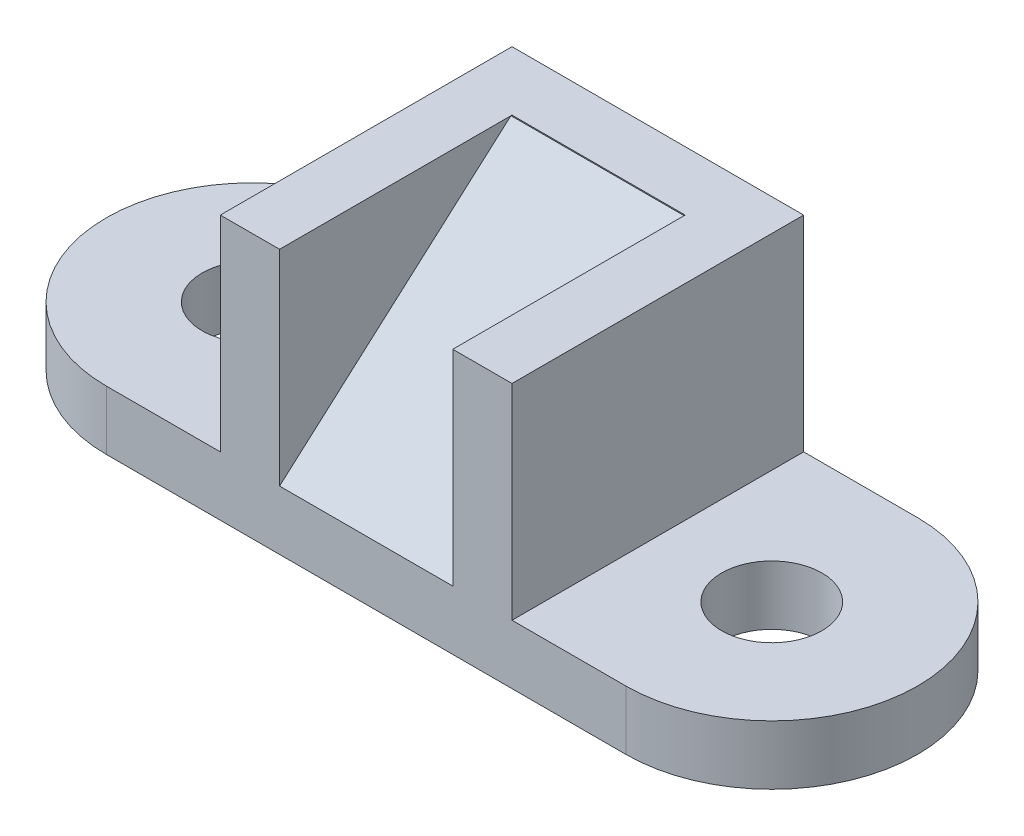
ISO-10303-21;
HEADER;
FILE_DESCRIPTION(('STEP AP214'),'2;1');
FILE_NAME('part.step','',(''),(''),'','','');
FILE_SCHEMA(('AUTOMOTIVE_DESIGN { 1 0 10303 214 1 1 1 1 }'));
ENDSEC;
DATA;
#1=APPLICATION_CONTEXT('core data for automotive mechanical design processes');
#2=APPLICATION_PROTOCOL_DEFINITION('international standard','automotive_design',2000,#1);
#3=PRODUCT_CONTEXT('',#1,'mechanical');
#4=PRODUCT('Part','Part','',(#3));
#5=PRODUCT_RELATED_PRODUCT_CATEGORY('part','',(#4));
#6=PRODUCT_DEFINITION_FORMATION('','',#4);
#7=PRODUCT_DEFINITION_CONTEXT('part definition',#1,'design');
#8=PRODUCT_DEFINITION('design','',#6,#7);
#9=PRODUCT_DEFINITION_SHAPE('','',#8);
#10=(LENGTH_UNIT() NAMED_UNIT(*) SI_UNIT(.MILLI.,.METRE.));
#11=(NAMED_UNIT(*) PLANE_ANGLE_UNIT() SI_UNIT($,.RADIAN.));
#12=(NAMED_UNIT(*) SI_UNIT($,.STERADIAN.) SOLID_ANGLE_UNIT());
#13=UNCERTAINTY_MEASURE_WITH_UNIT(LENGTH_MEASURE(1.E-05),#10,'distance_accuracy_value','');
#14=(GEOMETRIC_REPRESENTATION_CONTEXT(3) GLOBAL_UNCERTAINTY_ASSIGNED_CONTEXT((#13)) GLOBAL_UNIT_ASSIGNED_CONTEXT((#10,
#11,#12)) REPRESENTATION_CONTEXT('',''));
#15=CARTESIAN_POINT('',(0.,0.,0.));
#16=DIRECTION('',(0.,0.,1.));
#17=DIRECTION('',(1.,0.,0.));
#18=AXIS2_PLACEMENT_3D('',#15,#16,#17);
#19=CARTESIAN_POINT('',(19.,13.,32.));
#20=DIRECTION('',(1.,0.,0.));
#21=DIRECTION('',(0.,0.,-1.));
#22=AXIS2_PLACEMENT_3D('',#19,#20,#21);
#23=PLANE('',#22);
#24=DIRECTION('',(0.,-1.,0.));
#25=VECTOR('',#24,1.);
#26=CARTESIAN_POINT('',(19.,13.,-18.7655936093863));
#27=LINE('',#26,#25);
#28=CARTESIAN_POINT('',(19.,58.,-18.7655936093863));
#29=VERTEX_POINT('',#28);
#30=CARTESIAN_POINT('',(19.,13.,-18.7655936093863));
#31=VERTEX_POINT('',#30);
#32=EDGE_CURVE('E54',#29,#31,#27,.T.);
#33=ORIENTED_EDGE('',*,*,#32,.F.);
#34=DIRECTION('',(0.,0.,-1.));
#35=VECTOR('',#34,1.);
#36=CARTESIAN_POINT('',(19.,58.,32.));
#37=LINE('',#36,#35);
#38=CARTESIAN_POINT('',(19.,58.,-19.));
#39=VERTEX_POINT('',#38);
#40=EDGE_CURVE('E181',#29,#39,#37,.T.);
#41=ORIENTED_EDGE('',*,*,#40,.T.);
#42=DIRECTION('',(0.,1.,0.));
#43=VECTOR('',#42,1.);
#44=CARTESIAN_POINT('',(19.,13.,-19.));
#45=LINE('',#44,#43);
#46=CARTESIAN_POINT('',(19.,13.,-19.));
#47=VERTEX_POINT('',#46);
#48=EDGE_CURVE('E151',#47,#39,#45,.T.);
#49=ORIENTED_EDGE('',*,*,#48,.F.);
#50=DIRECTION('',(0.,0.,-1.));
#51=VECTOR('',#50,1.);
#52=CARTESIAN_POINT('',(19.,13.,32.));
#53=LINE('',#52,#51);
#54=EDGE_CURVE('E164',#31,#47,#53,.T.);
#55=ORIENTED_EDGE('',*,*,#54,.F.);
#56=EDGE_LOOP('',(#33,#41,#49,#55));
#57=FACE_BOUND('',#56,.T.);
#58=ADVANCED_FACE('F39',(#57),#23,.F.);
#59=DIRECTION('',(0.,0.663334127281567,-0.748323349618066));
#60=VECTOR('',#59,1.);
#61=CARTESIAN_POINT('',(19.,13.,32.));
#62=LINE('',#61,#60);
#63=CARTESIAN_POINT('',(19.,13.,32.));
#64=VERTEX_POINT('',#63);
#65=EDGE_CURVE('E155',#64,#29,#62,.T.);
#66=ORIENTED_EDGE('',*,*,#65,.F.);
#67=DIRECTION('',(0.,1.,0.));
#68=VECTOR('',#67,1.);
#69=CARTESIAN_POINT('',(19.,13.,32.));
#70=LINE('',#69,#68);
#71=CARTESIAN_POINT('',(19.,58.,32.));
#72=VERTEX_POINT('',#71);
#73=EDGE_CURVE('E140',#64,#72,#70,.T.);
#74=ORIENTED_EDGE('',*,*,#73,.T.);
#75=EDGE_CURVE('E157',#72,#29,#37,.T.);
#76=ORIENTED_EDGE('',*,*,#75,.T.);
#77=EDGE_LOOP('',(#66,#74,#76));
#78=FACE_BOUND('',#77,.T.);
#79=ADVANCED_FACE('F156',(#78),#23,.F.);
#80=CARTESIAN_POINT('',(-19.,13.,-19.));
#81=DIRECTION('',(-1.,0.,0.));
#82=DIRECTION('',(0.,0.,1.));
#83=AXIS2_PLACEMENT_3D('',#80,#81,#82);
#84=PLANE('',#83);
#85=DIRECTION('',(0.,1.,0.));
#86=VECTOR('',#85,1.);
#87=CARTESIAN_POINT('',(-19.,13.,-18.7655936093863));
#88=LINE('',#87,#86);
#89=CARTESIAN_POINT('',(-19.,13.,-18.7655936093863));
#90=VERTEX_POINT('',#89);
#91=CARTESIAN_POINT('',(-19.,58.,-18.7655936093863));
#92=VERTEX_POINT('',#91);
#93=EDGE_CURVE('E472',#90,#92,#88,.T.);
#94=ORIENTED_EDGE('',*,*,#93,.F.);
#95=DIRECTION('',(0.,0.,1.));
#96=VECTOR('',#95,1.);
#97=CARTESIAN_POINT('',(-19.,13.,-19.));
#98=LINE('',#97,#96);
#99=CARTESIAN_POINT('',(-19.,13.,-19.));
#100=VERTEX_POINT('',#99);
#101=EDGE_CURVE('E165',#100,#90,#98,.T.);
#102=ORIENTED_EDGE('',*,*,#101,.F.);
#103=DIRECTION('',(0.,1.,0.));
#104=VECTOR('',#103,1.);
#105=CARTESIAN_POINT('',(-19.,13.,-19.));
#106=LINE('',#105,#104);
#107=CARTESIAN_POINT('',(-19.,58.,-19.));
#108=VERTEX_POINT('',#107);
#109=EDGE_CURVE('E167',#100,#108,#106,.T.);
#110=ORIENTED_EDGE('',*,*,#109,.T.);
#111=DIRECTION('',(0.,0.,1.));
#112=VECTOR('',#111,1.);
#113=CARTESIAN_POINT('',(-19.,58.,-19.));
#114=LINE('',#113,#112);
#115=EDGE_CURVE('E178',#108,#92,#114,.T.);
#116=ORIENTED_EDGE('',*,*,#115,.T.);
#117=EDGE_LOOP('',(#94,#102,#110,#116));
#118=FACE_BOUND('',#117,.T.);
#119=ADVANCED_FACE('F316',(#118),#84,.F.);
#120=DIRECTION('',(0.,-0.663334127281567,0.748323349618066));
#121=VECTOR('',#120,1.);
#122=CARTESIAN_POINT('',(-19.,58.,-18.7655936093863));
#123=LINE('',#122,#121);
#124=CARTESIAN_POINT('',(-19.,13.,32.));
#125=VERTEX_POINT('',#124);
#126=EDGE_CURVE('E62',#92,#125,#123,.T.);
#127=ORIENTED_EDGE('',*,*,#126,.F.);
#128=CARTESIAN_POINT('',(-19.,58.,32.));
#129=VERTEX_POINT('',#128);
#130=EDGE_CURVE('E177',#92,#129,#114,.T.);
#131=ORIENTED_EDGE('',*,*,#130,.T.);
#132=DIRECTION('',(0.,1.,0.));
#133=VECTOR('',#132,1.);
#134=CARTESIAN_POINT('',(-19.,13.,32.));
#135=LINE('',#134,#133);
#136=EDGE_CURVE('E152',#125,#129,#135,.T.);
#137=ORIENTED_EDGE('',*,*,#136,.F.);
#138=EDGE_LOOP('',(#127,#131,#137));
#139=FACE_BOUND('',#138,.T.);
#140=ADVANCED_FACE('F323',(#139),#84,.F.);
#141=CARTESIAN_POINT('',(0.,13.,0.));
#142=DIRECTION('',(0.,1.,0.));
#143=DIRECTION('',(0.,0.,1.));
#144=AXIS2_PLACEMENT_3D('',#141,#142,#143);
#145=PLANE('',#144);
#146=ORIENTED_EDGE('',*,*,#101,.T.);
#147=DIRECTION('',(1.,0.,0.));
#148=VECTOR('',#147,1.);
#149=CARTESIAN_POINT('',(0.,13.,-18.7655936093863));
#150=LINE('',#149,#148);
#151=EDGE_CURVE('E11',#90,#31,#150,.T.);
#152=ORIENTED_EDGE('',*,*,#151,.T.);
#153=ORIENTED_EDGE('',*,*,#54,.T.);
#154=DIRECTION('',(-1.,0.,0.));
#155=VECTOR('',#154,1.);
#156=CARTESIAN_POINT('',(19.,13.,-19.));
#157=LINE('',#156,#155);
#158=EDGE_CURVE('E170',#47,#100,#157,.T.);
#159=ORIENTED_EDGE('',*,*,#158,.T.);
#160=EDGE_LOOP('',(#146,#152,#153,#159));
#161=FACE_BOUND('',#160,.T.);
#162=ADVANCED_FACE('F319',(#161),#145,.T.);
#163=CARTESIAN_POINT('',(-57.,58.,0.));
#164=DIRECTION('',(0.,-1.,0.));
#165=DIRECTION('',(0.,0.,-1.));
#166=AXIS2_PLACEMENT_3D('',#163,#164,#165);
#167=CYLINDRICAL_SURFACE('',#166,32.);
#168=CARTESIAN_POINT('',(-57.,13.,0.));
#169=DIRECTION('',(0.,1.,0.));
#170=DIRECTION('',(0.,0.,1.));
#171=AXIS2_PLACEMENT_3D('',#168,#169,#170);
#172=CIRCLE('',#171,32.);
#173=CARTESIAN_POINT('',(-57.,13.,-32.));
#174=VERTEX_POINT('',#173);
#175=CARTESIAN_POINT('',(-57.,13.,32.));
#176=VERTEX_POINT('',#175);
#177=EDGE_CURVE('E190',#174,#176,#172,.T.);
#178=ORIENTED_EDGE('',*,*,#177,.F.);
#179=DIRECTION('',(0.,-1.,0.));
#180=VECTOR('',#179,1.);
#181=CARTESIAN_POINT('',(-57.,58.,-32.));
#182=LINE('',#181,#180);
#183=CARTESIAN_POINT('',(-57.,0.,-32.));
#184=VERTEX_POINT('',#183);
#185=EDGE_CURVE('E234',#174,#184,#182,.T.);
#186=ORIENTED_EDGE('',*,*,#185,.T.);
#187=CARTESIAN_POINT('',(-57.,0.,0.));
#188=DIRECTION('',(0.,1.,0.));
#189=DIRECTION('',(0.,0.,1.));
#190=AXIS2_PLACEMENT_3D('',#187,#188,#189);
#191=CIRCLE('',#190,32.);
#192=CARTESIAN_POINT('',(-57.,0.,32.));
#193=VERTEX_POINT('',#192);
#194=EDGE_CURVE('E227',#184,#193,#191,.T.);
#195=ORIENTED_EDGE('',*,*,#194,.T.);
#196=DIRECTION('',(0.,-1.,0.));
#197=VECTOR('',#196,1.);
#198=CARTESIAN_POINT('',(-57.,58.,32.));
#199=LINE('',#198,#197);
#200=EDGE_CURVE('E47',#176,#193,#199,.T.);
#201=ORIENTED_EDGE('',*,*,#200,.F.);
#202=EDGE_LOOP('',(#178,#186,#195,#201));
#203=FACE_BOUND('',#202,.T.);
#204=ADVANCED_FACE('F41',(#203),#167,.T.);
#205=CARTESIAN_POINT('',(-57.,58.,0.));
#206=DIRECTION('',(0.,-1.,0.));
#207=DIRECTION('',(0.,0.,-1.));
#208=AXIS2_PLACEMENT_3D('',#205,#206,#207);
#209=CYLINDRICAL_SURFACE('',#208,11.);
#210=CARTESIAN_POINT('',(-57.,0.,0.));
#211=DIRECTION('',(0.,1.,0.));
#212=DIRECTION('',(0.,0.,1.));
#213=AXIS2_PLACEMENT_3D('',#210,#211,#212);
#214=CIRCLE('',#213,11.);
#215=CARTESIAN_POINT('',(-57.,0.,-11.));
#216=VERTEX_POINT('',#215);
#217=EDGE_CURVE('E223',#216,#216,#214,.T.);
#218=CARTESIAN_POINT('',(-57.,13.,0.));
#219=DIRECTION('',(0.,1.,0.));
#220=DIRECTION('',(0.,0.,1.));
#221=AXIS2_PLACEMENT_3D('',#218,#219,#220);
#222=CIRCLE('',#221,11.);
#223=CARTESIAN_POINT('',(-57.,13.,-11.));
#224=VERTEX_POINT('',#223);
#225=EDGE_CURVE('E224',#224,#224,#222,.T.);
#226=CARTESIAN_POINT('',(-57.,0.,-11.));
#227=CARTESIAN_POINT('',(-57.,0.135416666666666,-11.));
#228=CARTESIAN_POINT('',(-57.,0.270833333333331,-11.));
#229=CARTESIAN_POINT('',(-57.,0.541666666666665,-11.));
#230=CARTESIAN_POINT('',(-57.,0.677083333333333,-11.));
#231=CARTESIAN_POINT('',(-57.,0.947916666666666,-11.));
#232=CARTESIAN_POINT('',(-57.,1.08333333333333,-11.));
#233=CARTESIAN_POINT('',(-57.,1.35416666666667,-11.));
#234=CARTESIAN_POINT('',(-57.,1.48958333333333,-11.));
#235=CARTESIAN_POINT('',(-57.,1.76041666666667,-11.));
#236=CARTESIAN_POINT('',(-57.,1.89583333333333,-11.));
#237=CARTESIAN_POINT('',(-57.,2.16666666666667,-11.));
#238=CARTESIAN_POINT('',(-57.,2.30208333333333,-11.));
#239=CARTESIAN_POINT('',(-57.,2.57291666666667,-11.));
#240=CARTESIAN_POINT('',(-57.,2.70833333333333,-11.));
#241=CARTESIAN_POINT('',(-57.,2.97916666666667,-11.));
#242=CARTESIAN_POINT('',(-57.,3.11458333333334,-11.));
#243=CARTESIAN_POINT('',(-57.,3.38541666666667,-11.));
#244=CARTESIAN_POINT('',(-57.,3.52083333333333,-11.));
#245=CARTESIAN_POINT('',(-57.,3.79166666666667,-11.));
#246=CARTESIAN_POINT('',(-57.,3.92708333333333,-11.));
#247=CARTESIAN_POINT('',(-57.,4.19791666666667,-11.));
#248=CARTESIAN_POINT('',(-57.,4.33333333333333,-11.));
#249=CARTESIAN_POINT('',(-57.,4.60416666666667,-11.));
#250=CARTESIAN_POINT('',(-57.,4.73958333333333,-11.));
#251=CARTESIAN_POINT('',(-57.,5.01041666666667,-11.));
#252=CARTESIAN_POINT('',(-57.,5.14583333333333,-11.));
#253=CARTESIAN_POINT('',(-57.,5.41666666666667,-11.));
#254=CARTESIAN_POINT('',(-57.,5.55208333333333,-11.));
#255=CARTESIAN_POINT('',(-57.,5.82291666666666,-11.));
#256=CARTESIAN_POINT('',(-57.,5.95833333333333,-11.));
#257=CARTESIAN_POINT('',(-57.,6.22916666666666,-11.));
#258=CARTESIAN_POINT('',(-57.,6.36458333333333,-11.));
#259=CARTESIAN_POINT('',(-57.,6.63541666666667,-11.));
#260=CARTESIAN_POINT('',(-57.,6.77083333333333,-11.));
#261=CARTESIAN_POINT('',(-57.,7.04166666666667,-11.));
#262=CARTESIAN_POINT('',(-57.,7.17708333333333,-11.));
#263=CARTESIAN_POINT('',(-57.,7.44791666666667,-11.));
#264=CARTESIAN_POINT('',(-57.,7.58333333333333,-11.));
#265=CARTESIAN_POINT('',(-57.,7.85416666666666,-11.));
#266=CARTESIAN_POINT('',(-57.,7.98958333333333,-11.));
#267=CARTESIAN_POINT('',(-57.,8.26041666666667,-11.));
#268=CARTESIAN_POINT('',(-57.,8.39583333333333,-11.));
#269=CARTESIAN_POINT('',(-57.,8.66666666666666,-11.));
#270=CARTESIAN_POINT('',(-57.,8.80208333333333,-11.));
#271=CARTESIAN_POINT('',(-57.,9.07291666666667,-11.));
#272=CARTESIAN_POINT('',(-57.,9.20833333333333,-11.));
#273=CARTESIAN_POINT('',(-57.,9.47916666666666,-11.));
#274=CARTESIAN_POINT('',(-57.,9.61458333333333,-11.));
#275=CARTESIAN_POINT('',(-57.,9.88541666666666,-11.));
#276=CARTESIAN_POINT('',(-57.,10.0208333333333,-11.));
#277=CARTESIAN_POINT('',(-57.,10.2916666666667,-11.));
#278=CARTESIAN_POINT('',(-57.,10.4270833333333,-11.));
#279=CARTESIAN_POINT('',(-57.,10.6979166666667,-11.));
#280=CARTESIAN_POINT('',(-57.,10.8333333333333,-11.));
#281=CARTESIAN_POINT('',(-57.,11.1041666666667,-11.));
#282=CARTESIAN_POINT('',(-57.,11.2395833333333,-11.));
#283=CARTESIAN_POINT('',(-57.,11.5104166666667,-11.));
#284=CARTESIAN_POINT('',(-57.,11.6458333333333,-11.));
#285=CARTESIAN_POINT('',(-57.,11.9166666666667,-11.));
#286=CARTESIAN_POINT('',(-57.,12.0520833333333,-11.));
#287=CARTESIAN_POINT('',(-57.,12.3229166666667,-11.));
#288=CARTESIAN_POINT('',(-57.,12.4583333333333,-11.));
#289=CARTESIAN_POINT('',(-57.,12.7291666666667,-11.));
#290=CARTESIAN_POINT('',(-57.,12.8645833333333,-11.));
#291=CARTESIAN_POINT('',(-57.,13.,-11.));
#292=B_SPLINE_CURVE_WITH_KNOTS('',3,(#226,#227,#228,#229,#230,#231,#232,#233,#234,#235,#236,
#237,#238,#239,#240,#241,#242,#243,#244,#245,#246,#247,#248,#249,#250,#251,#252,#253,#254,#255,
#256,#257,#258,#259,#260,#261,#262,#263,#264,#265,#266,#267,#268,#269,#270,#271,#272,#273,#274,
#275,#276,#277,#278,#279,#280,#281,#282,#283,#284,#285,#286,#287,#288,#289,#290,#291),
.UNSPECIFIED.,.F.,.F.,(4,2,2,2,2,2,2,2,2,2,2,2,2,2,2,2,2,2,2,2,2,2,2,2,2,2,2,2,2,2,2,2,4),(0.,
0.406249999999997,0.812500000000001,1.21875,1.625,2.03125,2.4375,2.84375,3.25,3.65625,4.0625,
4.46875,4.875,5.28125,5.6875,6.09374999999999,6.5,6.90625,7.3125,7.71875,8.125,8.53125,8.9375,
9.34375,9.74999999999999,10.15625,10.5625,10.96875,11.375,11.78125,12.1875,12.59375,13.),.UNSPECIFIED.);
#293=EDGE_CURVE('BSEAM256',#216,#224,#292,.T.);
#294=ORIENTED_EDGE('',*,*,#217,.F.);
#295=ORIENTED_EDGE('',*,*,#225,.T.);
#296=ORIENTED_EDGE('',*,*,#293,.T.);
#297=ORIENTED_EDGE('',*,*,#293,.F.);
#298=EDGE_LOOP('',(#294,#296,#295,#297));
#299=FACE_BOUND('',#298,.T.);
#300=ADVANCED_FACE('F256',(#299),#209,.F.);
#301=CARTESIAN_POINT('',(-57.,58.,0.));
#302=DIRECTION('',(0.,1.,0.));
#303=DIRECTION('',(0.,0.,1.));
#304=AXIS2_PLACEMENT_3D('',#301,#302,#303);
#305=PLANE('',#304);
#306=ORIENTED_EDGE('',*,*,#40,.F.);
#307=ORIENTED_EDGE('',*,*,#75,.F.);
#308=DIRECTION('',(1.,0.,0.));
#309=VECTOR('',#308,1.);
#310=CARTESIAN_POINT('',(57.,58.,32.));
#311=LINE('',#310,#309);
#312=CARTESIAN_POINT('',(32.,58.,32.));
#313=VERTEX_POINT('',#312);
#314=EDGE_CURVE('E147',#72,#313,#311,.T.);
#315=ORIENTED_EDGE('',*,*,#314,.T.);
#316=DIRECTION('',(0.,0.,1.));
#317=VECTOR('',#316,1.);
#318=CARTESIAN_POINT('',(32.,58.,-32.));
#319=LINE('',#318,#317);
#320=CARTESIAN_POINT('',(32.,58.,-32.));
#321=VERTEX_POINT('',#320);
#322=EDGE_CURVE('E199',#321,#313,#319,.T.);
#323=ORIENTED_EDGE('',*,*,#322,.F.);
#324=DIRECTION('',(-1.,0.,0.));
#325=VECTOR('',#324,1.);
#326=CARTESIAN_POINT('',(57.,58.,-32.));
#327=LINE('',#326,#325);
#328=CARTESIAN_POINT('',(-32.,58.,-32.));
#329=VERTEX_POINT('',#328);
#330=EDGE_CURVE('E231',#321,#329,#327,.T.);
#331=ORIENTED_EDGE('',*,*,#330,.T.);
#332=DIRECTION('',(0.,0.,-1.));
#333=VECTOR('',#332,1.);
#334=CARTESIAN_POINT('',(-32.,58.,-32.));
#335=LINE('',#334,#333);
#336=CARTESIAN_POINT('',(-32.,58.,32.));
#337=VERTEX_POINT('',#336);
#338=EDGE_CURVE('E191',#337,#329,#335,.T.);
#339=ORIENTED_EDGE('',*,*,#338,.F.);
#340=EDGE_CURVE('E228',#337,#129,#311,.T.);
#341=ORIENTED_EDGE('',*,*,#340,.T.);
#342=ORIENTED_EDGE('',*,*,#130,.F.);
#343=ORIENTED_EDGE('',*,*,#115,.F.);
#344=DIRECTION('',(-1.,0.,0.));
#345=VECTOR('',#344,1.);
#346=CARTESIAN_POINT('',(19.,58.,-19.));
#347=LINE('',#346,#345);
#348=EDGE_CURVE('E174',#39,#108,#347,.T.);
#349=ORIENTED_EDGE('',*,*,#348,.F.);
#350=EDGE_LOOP('',(#306,#307,#315,#323,#331,#339,#341,#342,#343,#349));
#351=FACE_BOUND('',#350,.T.);
#352=ADVANCED_FACE('F293',(#351),#305,.T.);
#353=CARTESIAN_POINT('',(-57.,0.,0.));
#354=DIRECTION('',(0.,1.,0.));
#355=DIRECTION('',(0.,0.,1.));
#356=AXIS2_PLACEMENT_3D('',#353,#354,#355);
#357=PLANE('',#356);
#358=ORIENTED_EDGE('',*,*,#194,.F.);
#359=DIRECTION('',(-1.,0.,0.));
#360=VECTOR('',#359,1.);
#361=CARTESIAN_POINT('',(57.,0.,-32.));
#362=LINE('',#361,#360);
#363=CARTESIAN_POINT('',(57.,0.,-32.));
#364=VERTEX_POINT('',#363);
#365=EDGE_CURVE('E243',#364,#184,#362,.T.);
#366=ORIENTED_EDGE('',*,*,#365,.F.);
#367=CARTESIAN_POINT('',(57.,0.,0.));
#368=DIRECTION('',(0.,1.,0.));
#369=DIRECTION('',(0.,0.,-1.));
#370=AXIS2_PLACEMENT_3D('',#367,#368,#369);
#371=CIRCLE('',#370,32.);
#372=CARTESIAN_POINT('',(57.,0.,32.));
#373=VERTEX_POINT('',#372);
#374=EDGE_CURVE('E240',#373,#364,#371,.T.);
#375=ORIENTED_EDGE('',*,*,#374,.F.);
#376=DIRECTION('',(1.,0.,0.));
#377=VECTOR('',#376,1.);
#378=CARTESIAN_POINT('',(57.,0.,32.));
#379=LINE('',#378,#377);
#380=EDGE_CURVE('E237',#193,#373,#379,.T.);
#381=ORIENTED_EDGE('',*,*,#380,.F.);
#382=EDGE_LOOP('',(#358,#366,#375,#381));
#383=FACE_BOUND('',#382,.T.);
#384=ORIENTED_EDGE('',*,*,#217,.T.);
#385=EDGE_LOOP('',(#384));
#386=FACE_BOUND('',#385,.T.);
#387=CARTESIAN_POINT('',(57.,0.,0.));
#388=DIRECTION('',(0.,1.,0.));
#389=DIRECTION('',(0.,0.,-1.));
#390=AXIS2_PLACEMENT_3D('',#387,#388,#389);
#391=CIRCLE('',#390,11.);
#392=CARTESIAN_POINT('',(57.,0.,-11.));
#393=VERTEX_POINT('',#392);
#394=EDGE_CURVE('E220',#393,#393,#391,.T.);
#395=ORIENTED_EDGE('',*,*,#394,.T.);
#396=EDGE_LOOP('',(#395));
#397=FACE_BOUND('',#396,.T.);
#398=ADVANCED_FACE('F281',(#383,#386,#397),#357,.F.);
#399=CARTESIAN_POINT('',(57.,58.,32.));
#400=DIRECTION('',(0.,0.,-1.));
#401=DIRECTION('',(-1.,0.,0.));
#402=AXIS2_PLACEMENT_3D('',#399,#400,#401);
#403=PLANE('',#402);
#404=ORIENTED_EDGE('',*,*,#314,.F.);
#405=ORIENTED_EDGE('',*,*,#73,.F.);
#406=DIRECTION('',(1.,0.,0.));
#407=VECTOR('',#406,1.);
#408=CARTESIAN_POINT('',(-19.,13.,32.));
#409=LINE('',#408,#407);
#410=EDGE_CURVE('E145',#125,#64,#409,.T.);
#411=ORIENTED_EDGE('',*,*,#410,.F.);
#412=ORIENTED_EDGE('',*,*,#136,.T.);
#413=ORIENTED_EDGE('',*,*,#340,.F.);
#414=DIRECTION('',(0.,1.,0.));
#415=VECTOR('',#414,1.);
#416=CARTESIAN_POINT('',(-32.,13.,32.));
#417=LINE('',#416,#415);
#418=CARTESIAN_POINT('',(-32.,13.,32.));
#419=VERTEX_POINT('',#418);
#420=EDGE_CURVE('E197',#419,#337,#417,.T.);
#421=ORIENTED_EDGE('',*,*,#420,.F.);
#422=DIRECTION('',(1.,0.,0.));
#423=VECTOR('',#422,1.);
#424=CARTESIAN_POINT('',(-32.,13.,32.));
#425=LINE('',#424,#423);
#426=EDGE_CURVE('E193',#176,#419,#425,.T.);
#427=ORIENTED_EDGE('',*,*,#426,.F.);
#428=ORIENTED_EDGE('',*,*,#200,.T.);
#429=ORIENTED_EDGE('',*,*,#380,.T.);
#430=DIRECTION('',(0.,-1.,0.));
#431=VECTOR('',#430,1.);
#432=CARTESIAN_POINT('',(57.,58.,32.));
#433=LINE('',#432,#431);
#434=CARTESIAN_POINT('',(57.,13.,32.));
#435=VERTEX_POINT('',#434);
#436=EDGE_CURVE('E249',#435,#373,#433,.T.);
#437=ORIENTED_EDGE('',*,*,#436,.F.);
#438=DIRECTION('',(1.,0.,0.));
#439=VECTOR('',#438,1.);
#440=CARTESIAN_POINT('',(32.,13.,32.));
#441=LINE('',#440,#439);
#442=CARTESIAN_POINT('',(32.,13.,32.));
#443=VERTEX_POINT('',#442);
#444=EDGE_CURVE('E213',#443,#435,#441,.T.);
#445=ORIENTED_EDGE('',*,*,#444,.F.);
#446=DIRECTION('',(0.,1.,0.));
#447=VECTOR('',#446,1.);
#448=CARTESIAN_POINT('',(32.,13.,32.));
#449=LINE('',#448,#447);
#450=EDGE_CURVE('E184',#443,#313,#449,.T.);
#451=ORIENTED_EDGE('',*,*,#450,.T.);
#452=EDGE_LOOP('',(#404,#405,#411,#412,#413,#421,#427,#428,#429,#437,#445,#451));
#453=FACE_BOUND('',#452,.T.);
#454=ADVANCED_FACE('F142',(#453),#403,.F.);
#455=CARTESIAN_POINT('',(57.,58.,0.));
#456=DIRECTION('',(0.,-1.,0.));
#457=DIRECTION('',(0.,0.,-1.));
#458=AXIS2_PLACEMENT_3D('',#455,#456,#457);
#459=CYLINDRICAL_SURFACE('',#458,32.);
#460=DIRECTION('',(0.,-1.,0.));
#461=VECTOR('',#460,1.);
#462=CARTESIAN_POINT('',(57.,58.,-32.));
#463=LINE('',#462,#461);
#464=CARTESIAN_POINT('',(57.,13.,-32.));
#465=VERTEX_POINT('',#464);
#466=EDGE_CURVE('E247',#465,#364,#463,.T.);
#467=ORIENTED_EDGE('',*,*,#466,.F.);
#468=CARTESIAN_POINT('',(57.,13.,0.));
#469=DIRECTION('',(0.,1.,0.));
#470=DIRECTION('',(0.,0.,-1.));
#471=AXIS2_PLACEMENT_3D('',#468,#469,#470);
#472=CIRCLE('',#471,32.);
#473=EDGE_CURVE('E207',#435,#465,#472,.T.);
#474=ORIENTED_EDGE('',*,*,#473,.F.);
#475=ORIENTED_EDGE('',*,*,#436,.T.);
#476=ORIENTED_EDGE('',*,*,#374,.T.);
#477=EDGE_LOOP('',(#467,#474,#475,#476));
#478=FACE_BOUND('',#477,.T.);
#479=ADVANCED_FACE('F300',(#478),#459,.T.);
#480=CARTESIAN_POINT('',(57.,58.,-32.));
#481=DIRECTION('',(0.,0.,1.));
#482=DIRECTION('',(1.,0.,0.));
#483=AXIS2_PLACEMENT_3D('',#480,#481,#482);
#484=PLANE('',#483);
#485=DIRECTION('',(-1.,0.,0.));
#486=VECTOR('',#485,1.);
#487=CARTESIAN_POINT('',(-32.,13.,-32.));
#488=LINE('',#487,#486);
#489=CARTESIAN_POINT('',(-32.,13.,-32.));
#490=VERTEX_POINT('',#489);
#491=EDGE_CURVE('E188',#490,#174,#488,.T.);
#492=ORIENTED_EDGE('',*,*,#491,.F.);
#493=DIRECTION('',(0.,1.,0.));
#494=VECTOR('',#493,1.);
#495=CARTESIAN_POINT('',(-32.,13.,-32.));
#496=LINE('',#495,#494);
#497=EDGE_CURVE('E200',#490,#329,#496,.T.);
#498=ORIENTED_EDGE('',*,*,#497,.T.);
#499=ORIENTED_EDGE('',*,*,#330,.F.);
#500=DIRECTION('',(0.,1.,0.));
#501=VECTOR('',#500,1.);
#502=CARTESIAN_POINT('',(32.,13.,-32.));
#503=LINE('',#502,#501);
#504=CARTESIAN_POINT('',(32.,13.,-32.));
#505=VERTEX_POINT('',#504);
#506=EDGE_CURVE('E205',#505,#321,#503,.T.);
#507=ORIENTED_EDGE('',*,*,#506,.F.);
#508=DIRECTION('',(-1.,0.,0.));
#509=VECTOR('',#508,1.);
#510=CARTESIAN_POINT('',(32.,13.,-32.));
#511=LINE('',#510,#509);
#512=EDGE_CURVE('E211',#465,#505,#511,.T.);
#513=ORIENTED_EDGE('',*,*,#512,.F.);
#514=ORIENTED_EDGE('',*,*,#466,.T.);
#515=ORIENTED_EDGE('',*,*,#365,.T.);
#516=ORIENTED_EDGE('',*,*,#185,.F.);
#517=EDGE_LOOP('',(#492,#498,#499,#507,#513,#514,#515,#516));
#518=FACE_BOUND('',#517,.T.);
#519=ADVANCED_FACE('F273',(#518),#484,.F.);
#520=CARTESIAN_POINT('',(57.,58.,0.));
#521=DIRECTION('',(0.,-1.,0.));
#522=DIRECTION('',(0.,0.,-1.));
#523=AXIS2_PLACEMENT_3D('',#520,#521,#522);
#524=CYLINDRICAL_SURFACE('',#523,11.);
#525=CARTESIAN_POINT('',(57.,13.,0.));
#526=DIRECTION('',(0.,-1.,0.));
#527=DIRECTION('',(0.,0.,-1.));
#528=AXIS2_PLACEMENT_3D('',#525,#526,#527);
#529=CIRCLE('',#528,11.);
#530=CARTESIAN_POINT('',(57.,13.,-11.));
#531=VERTEX_POINT('',#530);
#532=EDGE_CURVE('E203',#531,#531,#529,.T.);
#533=CARTESIAN_POINT('',(57.,13.,-11.));
#534=CARTESIAN_POINT('',(57.,12.8645833333333,-11.));
#535=CARTESIAN_POINT('',(57.,12.7291666666667,-11.));
#536=CARTESIAN_POINT('',(57.,12.4583333333333,-11.));
#537=CARTESIAN_POINT('',(57.,12.3229166666667,-11.));
#538=CARTESIAN_POINT('',(57.,12.0520833333333,-11.));
#539=CARTESIAN_POINT('',(57.,11.9166666666667,-11.));
#540=CARTESIAN_POINT('',(57.,11.6458333333333,-11.));
#541=CARTESIAN_POINT('',(57.,11.5104166666667,-11.));
#542=CARTESIAN_POINT('',(57.,11.2395833333333,-11.));
#543=CARTESIAN_POINT('',(57.,11.1041666666667,-11.));
#544=CARTESIAN_POINT('',(57.,10.8333333333333,-11.));
#545=CARTESIAN_POINT('',(57.,10.6979166666667,-11.));
#546=CARTESIAN_POINT('',(57.,10.4270833333333,-11.));
#547=CARTESIAN_POINT('',(57.,10.2916666666667,-11.));
#548=CARTESIAN_POINT('',(57.,10.0208333333333,-11.));
#549=CARTESIAN_POINT('',(57.,9.88541666666667,-11.));
#550=CARTESIAN_POINT('',(57.,9.61458333333334,-11.));
#551=CARTESIAN_POINT('',(57.,9.47916666666668,-11.));
#552=CARTESIAN_POINT('',(57.,9.20833333333334,-11.));
#553=CARTESIAN_POINT('',(57.,9.07291666666667,-11.));
#554=CARTESIAN_POINT('',(57.,8.80208333333334,-11.));
#555=CARTESIAN_POINT('',(57.,8.66666666666667,-11.));
#556=CARTESIAN_POINT('',(57.,8.39583333333334,-11.));
#557=CARTESIAN_POINT('',(57.,8.26041666666667,-11.));
#558=CARTESIAN_POINT('',(57.,7.98958333333334,-11.));
#559=CARTESIAN_POINT('',(57.,7.85416666666668,-11.));
#560=CARTESIAN_POINT('',(57.,7.58333333333334,-11.));
#561=CARTESIAN_POINT('',(57.,7.44791666666667,-11.));
#562=CARTESIAN_POINT('',(57.,7.17708333333334,-11.));
#563=CARTESIAN_POINT('',(57.,7.04166666666667,-11.));
#564=CARTESIAN_POINT('',(57.,6.77083333333334,-11.));
#565=CARTESIAN_POINT('',(57.,6.63541666666667,-11.));
#566=CARTESIAN_POINT('',(57.,6.36458333333334,-11.));
#567=CARTESIAN_POINT('',(57.,6.22916666666667,-11.));
#568=CARTESIAN_POINT('',(57.,5.95833333333334,-11.));
#569=CARTESIAN_POINT('',(57.,5.82291666666667,-11.));
#570=CARTESIAN_POINT('',(57.,5.55208333333334,-11.));
#571=CARTESIAN_POINT('',(57.,5.41666666666667,-11.));
#572=CARTESIAN_POINT('',(57.,5.14583333333334,-11.));
#573=CARTESIAN_POINT('',(57.,5.01041666666667,-11.));
#574=CARTESIAN_POINT('',(57.,4.73958333333334,-11.));
#575=CARTESIAN_POINT('',(57.,4.60416666666667,-11.));
#576=CARTESIAN_POINT('',(57.,4.33333333333334,-11.));
#577=CARTESIAN_POINT('',(57.,4.19791666666667,-11.));
#578=CARTESIAN_POINT('',(57.,3.92708333333334,-11.));
#579=CARTESIAN_POINT('',(57.,3.79166666666667,-11.));
#580=CARTESIAN_POINT('',(57.,3.52083333333333,-11.));
#581=CARTESIAN_POINT('',(57.,3.38541666666667,-11.));
#582=CARTESIAN_POINT('',(57.,3.11458333333334,-11.));
#583=CARTESIAN_POINT('',(57.,2.97916666666667,-11.));
#584=CARTESIAN_POINT('',(57.,2.70833333333334,-11.));
#585=CARTESIAN_POINT('',(57.,2.57291666666667,-11.));
#586=CARTESIAN_POINT('',(57.,2.30208333333333,-11.));
#587=CARTESIAN_POINT('',(57.,2.16666666666667,-11.));
#588=CARTESIAN_POINT('',(57.,1.89583333333333,-11.));
#589=CARTESIAN_POINT('',(57.,1.76041666666667,-11.));
#590=CARTESIAN_POINT('',(57.,1.48958333333334,-11.));
#591=CARTESIAN_POINT('',(57.,1.35416666666667,-11.));
#592=CARTESIAN_POINT('',(57.,1.08333333333334,-11.));
#593=CARTESIAN_POINT('',(57.,0.947916666666669,-11.));
#594=CARTESIAN_POINT('',(57.,0.677083333333333,-11.));
#595=CARTESIAN_POINT('',(57.,0.541666666666665,-11.));
#596=CARTESIAN_POINT('',(57.,0.270833333333331,-11.));
#597=CARTESIAN_POINT('',(57.,0.135416666666666,-11.));
#598=CARTESIAN_POINT('',(57.,0.,-11.));
#599=B_SPLINE_CURVE_WITH_KNOTS('',3,(#533,#534,#535,#536,#537,#538,#539,#540,#541,#542,#543,
#544,#545,#546,#547,#548,#549,#550,#551,#552,#553,#554,#555,#556,#557,#558,#559,#560,#561,#562,
#563,#564,#565,#566,#567,#568,#569,#570,#571,#572,#573,#574,#575,#576,#577,#578,#579,#580,#581,
#582,#583,#584,#585,#586,#587,#588,#589,#590,#591,#592,#593,#594,#595,#596,#597,#598),
.UNSPECIFIED.,.F.,.F.,(4,2,2,2,2,2,2,2,2,2,2,2,2,2,2,2,2,2,2,2,2,2,2,2,2,2,2,2,2,2,2,2,4),(0.,
0.406249999999997,0.812500000000001,1.21875,1.625,2.03125,2.4375,2.84375000000001,3.25,3.65625,
4.0625,4.46875000000001,4.875,5.28125,5.68750000000001,6.09375000000001,6.50000000000001,
6.90625,7.31250000000001,7.71875000000001,8.12500000000001,8.53125,8.93750000000001,
9.34375000000001,9.75000000000001,10.15625,10.5625,10.96875,11.375,11.78125,12.1875,12.59375,
13.),.UNSPECIFIED.);
#600=EDGE_CURVE('BSEAM307',#531,#393,#599,.T.);
#601=ORIENTED_EDGE('',*,*,#532,.F.);
#602=ORIENTED_EDGE('',*,*,#394,.F.);
#603=ORIENTED_EDGE('',*,*,#600,.T.);
#604=ORIENTED_EDGE('',*,*,#600,.F.);
#605=EDGE_LOOP('',(#601,#603,#602,#604));
#606=FACE_BOUND('',#605,.T.);
#607=ADVANCED_FACE('F307',(#606),#524,.F.);
#608=CARTESIAN_POINT('',(32.,13.,-32.));
#609=DIRECTION('',(-1.,0.,0.));
#610=DIRECTION('',(0.,0.,1.));
#611=AXIS2_PLACEMENT_3D('',#608,#609,#610);
#612=PLANE('',#611);
#613=ORIENTED_EDGE('',*,*,#322,.T.);
#614=ORIENTED_EDGE('',*,*,#450,.F.);
#615=DIRECTION('',(0.,0.,1.));
#616=VECTOR('',#615,1.);
#617=CARTESIAN_POINT('',(32.,13.,-32.));
#618=LINE('',#617,#616);
#619=EDGE_CURVE('E215',#505,#443,#618,.T.);
#620=ORIENTED_EDGE('',*,*,#619,.F.);
#621=ORIENTED_EDGE('',*,*,#506,.T.);
#622=EDGE_LOOP('',(#613,#614,#620,#621));
#623=FACE_BOUND('',#622,.T.);
#624=ADVANCED_FACE('F295',(#623),#612,.F.);
#625=CARTESIAN_POINT('',(57.,13.,0.));
#626=DIRECTION('',(0.,-1.,0.));
#627=DIRECTION('',(0.,0.,-1.));
#628=AXIS2_PLACEMENT_3D('',#625,#626,#627);
#629=PLANE('',#628);
#630=ORIENTED_EDGE('',*,*,#532,.T.);
#631=EDGE_LOOP('',(#630));
#632=FACE_BOUND('',#631,.T.);
#633=ORIENTED_EDGE('',*,*,#512,.T.);
#634=ORIENTED_EDGE('',*,*,#619,.T.);
#635=ORIENTED_EDGE('',*,*,#444,.T.);
#636=ORIENTED_EDGE('',*,*,#473,.T.);
#637=EDGE_LOOP('',(#633,#634,#635,#636));
#638=FACE_BOUND('',#637,.T.);
#639=ADVANCED_FACE('F298',(#632,#638),#629,.F.);
#640=CARTESIAN_POINT('',(-32.,13.,-32.));
#641=DIRECTION('',(1.,0.,0.));
#642=DIRECTION('',(0.,0.,-1.));
#643=AXIS2_PLACEMENT_3D('',#640,#641,#642);
#644=PLANE('',#643);
#645=ORIENTED_EDGE('',*,*,#338,.T.);
#646=ORIENTED_EDGE('',*,*,#497,.F.);
#647=DIRECTION('',(0.,0.,-1.));
#648=VECTOR('',#647,1.);
#649=CARTESIAN_POINT('',(-32.,13.,-32.));
#650=LINE('',#649,#648);
#651=EDGE_CURVE('E195',#419,#490,#650,.T.);
#652=ORIENTED_EDGE('',*,*,#651,.F.);
#653=ORIENTED_EDGE('',*,*,#420,.T.);
#654=EDGE_LOOP('',(#645,#646,#652,#653));
#655=FACE_BOUND('',#654,.T.);
#656=ADVANCED_FACE('F262',(#655),#644,.F.);
#657=CARTESIAN_POINT('',(-57.,13.,0.));
#658=DIRECTION('',(0.,1.,0.));
#659=DIRECTION('',(0.,0.,1.));
#660=AXIS2_PLACEMENT_3D('',#657,#658,#659);
#661=PLANE('',#660);
#662=ORIENTED_EDGE('',*,*,#225,.F.);
#663=EDGE_LOOP('',(#662));
#664=FACE_BOUND('',#663,.T.);
#665=ORIENTED_EDGE('',*,*,#491,.T.);
#666=ORIENTED_EDGE('',*,*,#177,.T.);
#667=ORIENTED_EDGE('',*,*,#426,.T.);
#668=ORIENTED_EDGE('',*,*,#651,.T.);
#669=EDGE_LOOP('',(#665,#666,#667,#668));
#670=FACE_BOUND('',#669,.T.);
#671=ADVANCED_FACE('F258',(#664,#670),#661,.T.);
#672=CARTESIAN_POINT('',(19.,13.,-19.));
#673=DIRECTION('',(0.,0.,-1.));
#674=DIRECTION('',(-1.,0.,0.));
#675=AXIS2_PLACEMENT_3D('',#672,#673,#674);
#676=PLANE('',#675);
#677=ORIENTED_EDGE('',*,*,#348,.T.);
#678=ORIENTED_EDGE('',*,*,#109,.F.);
#679=ORIENTED_EDGE('',*,*,#158,.F.);
#680=ORIENTED_EDGE('',*,*,#48,.T.);
#681=EDGE_LOOP('',(#677,#678,#679,#680));
#682=FACE_BOUND('',#681,.T.);
#683=ADVANCED_FACE('F261',(#682),#676,.F.);
#684=CARTESIAN_POINT('',(26.,13.,-18.7655936093863));
#685=DIRECTION('',(0.,0.,1.));
#686=DIRECTION('',(1.,0.,0.));
#687=AXIS2_PLACEMENT_3D('',#684,#685,#686);
#688=PLANE('',#687);
#689=DIRECTION('',(-1.,0.,0.));
#690=VECTOR('',#689,1.);
#691=CARTESIAN_POINT('',(26.,58.,-18.7655936093863));
#692=LINE('',#691,#690);
#693=EDGE_CURVE('E161',#29,#92,#692,.T.);
#694=ORIENTED_EDGE('',*,*,#693,.F.);
#695=ORIENTED_EDGE('',*,*,#32,.T.);
#696=ORIENTED_EDGE('',*,*,#151,.F.);
#697=ORIENTED_EDGE('',*,*,#93,.T.);
#698=EDGE_LOOP('',(#694,#695,#696,#697));
#699=FACE_BOUND('',#698,.T.);
#700=ADVANCED_FACE('F325',(#699),#688,.F.);
#701=CARTESIAN_POINT('',(26.,58.,-18.7655936093863));
#702=DIRECTION('',(0.,-0.748323349618066,-0.663334127281567));
#703=DIRECTION('',(0.,0.663334127281567,-0.748323349618066));
#704=AXIS2_PLACEMENT_3D('',#701,#702,#703);
#705=PLANE('',#704);
#706=ORIENTED_EDGE('',*,*,#410,.T.);
#707=ORIENTED_EDGE('',*,*,#65,.T.);
#708=ORIENTED_EDGE('',*,*,#693,.T.);
#709=ORIENTED_EDGE('',*,*,#126,.T.);
#710=EDGE_LOOP('',(#706,#707,#708,#709));
#711=FACE_BOUND('',#710,.T.);
#712=ADVANCED_FACE('F163',(#711),#705,.F.);
#713=CLOSED_SHELL('',(#58,#79,#119,#140,#162,#204,#300,#352,#398,#454,#479,#519,#607,#624,#639,
#656,#671,#683,#700,#712));
#714=MANIFOLD_SOLID_BREP('B2',#713);
#715=ADVANCED_BREP_SHAPE_REPRESENTATION('',(#18,#714),#14);
#716=SHAPE_DEFINITION_REPRESENTATION(#9,#715);
ENDSEC;
END-ISO-10303-21;
